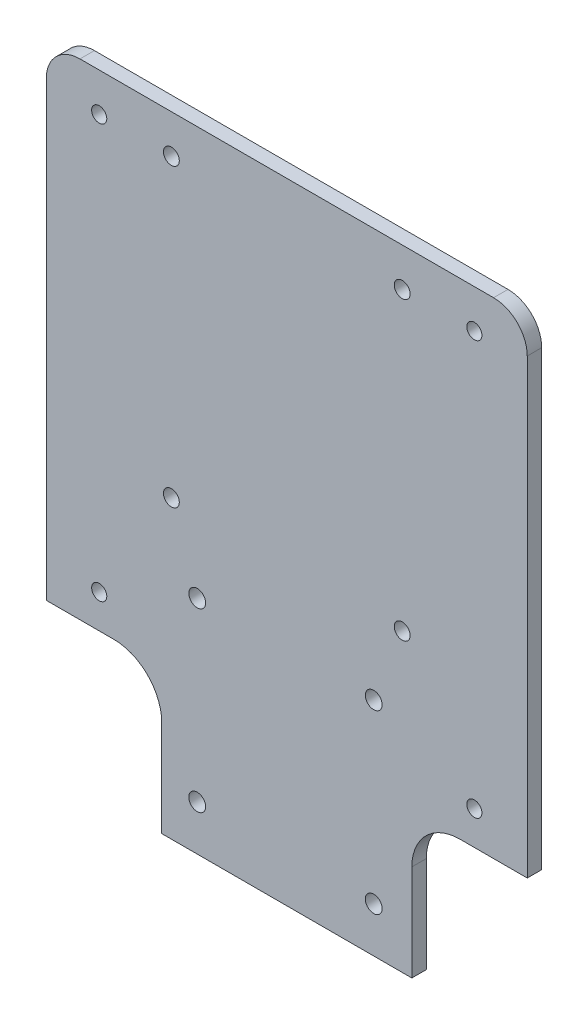
ISO-10303-21;
HEADER;
FILE_DESCRIPTION(('STEP AP214'),'2;1');
FILE_NAME('part.step','',(''),(''),'','','');
FILE_SCHEMA(('AUTOMOTIVE_DESIGN { 1 0 10303 214 1 1 1 1 }'));
ENDSEC;
DATA;
#1=APPLICATION_CONTEXT('core data for automotive mechanical design processes');
#2=APPLICATION_PROTOCOL_DEFINITION('international standard','automotive_design',2000,#1);
#3=PRODUCT_CONTEXT('',#1,'mechanical');
#4=PRODUCT('Part','Part','',(#3));
#5=PRODUCT_RELATED_PRODUCT_CATEGORY('part','',(#4));
#6=PRODUCT_DEFINITION_FORMATION('','',#4);
#7=PRODUCT_DEFINITION_CONTEXT('part definition',#1,'design');
#8=PRODUCT_DEFINITION('design','',#6,#7);
#9=PRODUCT_DEFINITION_SHAPE('','',#8);
#10=(LENGTH_UNIT() NAMED_UNIT(*) SI_UNIT(.MILLI.,.METRE.));
#11=(NAMED_UNIT(*) PLANE_ANGLE_UNIT() SI_UNIT($,.RADIAN.));
#12=(NAMED_UNIT(*) SI_UNIT($,.STERADIAN.) SOLID_ANGLE_UNIT());
#13=UNCERTAINTY_MEASURE_WITH_UNIT(LENGTH_MEASURE(1.E-05),#10,'distance_accuracy_value','');
#14=(GEOMETRIC_REPRESENTATION_CONTEXT(3) GLOBAL_UNCERTAINTY_ASSIGNED_CONTEXT((#13)) GLOBAL_UNIT_ASSIGNED_CONTEXT((#10,
#11,#12)) REPRESENTATION_CONTEXT('',''));
#15=CARTESIAN_POINT('',(0.,0.,0.));
#16=DIRECTION('',(0.,0.,1.));
#17=DIRECTION('',(1.,0.,0.));
#18=AXIS2_PLACEMENT_3D('',#15,#16,#17);
#19=CARTESIAN_POINT('',(43.,149.,30.));
#20=DIRECTION('',(0.,0.,1.));
#21=DIRECTION('',(1.,0.,0.));
#22=AXIS2_PLACEMENT_3D('',#19,#20,#21);
#23=PLANE('',#22);
#24=CARTESIAN_POINT('',(24.,147.97865418197,30.));
#25=DIRECTION('',(0.,0.,1.));
#26=DIRECTION('',(-1.,0.,0.));
#27=AXIS2_PLACEMENT_3D('',#24,#25,#26);
#28=CIRCLE('',#27,1.65000000000001);
#29=CARTESIAN_POINT('',(22.35,147.97865418197,30.));
#30=VERTEX_POINT('',#29);
#31=EDGE_CURVE('E513',#30,#30,#28,.T.);
#32=ORIENTED_EDGE('',*,*,#31,.F.);
#33=EDGE_LOOP('',(#32));
#34=FACE_BOUND('',#33,.T.);
#35=CARTESIAN_POINT('',(-24.,86.4786541819704,30.));
#36=DIRECTION('',(0.,0.,1.));
#37=DIRECTION('',(-1.,0.,0.));
#38=AXIS2_PLACEMENT_3D('',#35,#36,#37);
#39=CIRCLE('',#38,1.65);
#40=CARTESIAN_POINT('',(-25.65,86.4786541819704,30.));
#41=VERTEX_POINT('',#40);
#42=EDGE_CURVE('E524',#41,#41,#39,.T.);
#43=ORIENTED_EDGE('',*,*,#42,.F.);
#44=EDGE_LOOP('',(#43));
#45=FACE_BOUND('',#44,.T.);
#46=CARTESIAN_POINT('',(24.,86.4786541819704,30.));
#47=DIRECTION('',(0.,0.,1.));
#48=DIRECTION('',(1.,0.,0.));
#49=AXIS2_PLACEMENT_3D('',#46,#47,#48);
#50=CIRCLE('',#49,1.65);
#51=CARTESIAN_POINT('',(25.65,86.4786541819704,30.));
#52=VERTEX_POINT('',#51);
#53=EDGE_CURVE('E527',#52,#52,#50,.T.);
#54=ORIENTED_EDGE('',*,*,#53,.F.);
#55=EDGE_LOOP('',(#54));
#56=FACE_BOUND('',#55,.T.);
#57=CARTESIAN_POINT('',(-24.,147.97865418197,30.));
#58=DIRECTION('',(0.,0.,1.));
#59=DIRECTION('',(1.,0.,0.));
#60=AXIS2_PLACEMENT_3D('',#57,#58,#59);
#61=CIRCLE('',#60,1.65000000000001);
#62=CARTESIAN_POINT('',(-22.35,147.97865418197,30.));
#63=VERTEX_POINT('',#62);
#64=EDGE_CURVE('E210',#63,#63,#61,.T.);
#65=ORIENTED_EDGE('',*,*,#64,.F.);
#66=EDGE_LOOP('',(#65));
#67=FACE_BOUND('',#66,.T.);
#68=CARTESIAN_POINT('',(-39.,148.,30.));
#69=DIRECTION('',(0.,0.,1.));
#70=DIRECTION('',(1.,0.,0.));
#71=AXIS2_PLACEMENT_3D('',#68,#69,#70);
#72=CIRCLE('',#71,1.575);
#73=CARTESIAN_POINT('',(-37.425,148.,30.));
#74=VERTEX_POINT('',#73);
#75=EDGE_CURVE('E539',#74,#74,#72,.T.);
#76=ORIENTED_EDGE('',*,*,#75,.F.);
#77=EDGE_LOOP('',(#76));
#78=FACE_BOUND('',#77,.T.);
#79=CARTESIAN_POINT('',(-39.,61.9999999999998,30.));
#80=DIRECTION('',(0.,0.,1.));
#81=DIRECTION('',(1.,0.,0.));
#82=AXIS2_PLACEMENT_3D('',#79,#80,#81);
#83=CIRCLE('',#82,1.575);
#84=CARTESIAN_POINT('',(-37.425,61.9999999999998,30.));
#85=VERTEX_POINT('',#84);
#86=EDGE_CURVE('E551',#85,#85,#83,.T.);
#87=ORIENTED_EDGE('',*,*,#86,.F.);
#88=EDGE_LOOP('',(#87));
#89=FACE_BOUND('',#88,.T.);
#90=CARTESIAN_POINT('',(-18.6214451930755,34.3947889007737,30.));
#91=DIRECTION('',(0.,0.,1.));
#92=DIRECTION('',(1.,0.,0.));
#93=AXIS2_PLACEMENT_3D('',#90,#91,#92);
#94=CIRCLE('',#93,1.75);
#95=CARTESIAN_POINT('',(-16.8714451930755,34.3947889007737,30.));
#96=VERTEX_POINT('',#95);
#97=EDGE_CURVE('E563',#96,#96,#94,.T.);
#98=ORIENTED_EDGE('',*,*,#97,.F.);
#99=EDGE_LOOP('',(#98));
#100=FACE_BOUND('',#99,.T.);
#101=CARTESIAN_POINT('',(-18.6214451930756,71.0947889007737,30.));
#102=DIRECTION('',(0.,0.,1.));
#103=DIRECTION('',(1.,0.,0.));
#104=AXIS2_PLACEMENT_3D('',#101,#102,#103);
#105=CIRCLE('',#104,1.75);
#106=CARTESIAN_POINT('',(-16.8714451930756,71.0947889007737,30.));
#107=VERTEX_POINT('',#106);
#108=EDGE_CURVE('E170',#107,#107,#105,.T.);
#109=ORIENTED_EDGE('',*,*,#108,.F.);
#110=EDGE_LOOP('',(#109));
#111=FACE_BOUND('',#110,.T.);
#112=DIRECTION('',(0.,1.,0.));
#113=VECTOR('',#112,1.);
#114=CARTESIAN_POINT('',(50.,54.9999999999999,30.));
#115=LINE('',#114,#113);
#116=CARTESIAN_POINT('',(50.,54.9999999999999,30.));
#117=VERTEX_POINT('',#116);
#118=CARTESIAN_POINT('',(50.,149.,30.));
#119=VERTEX_POINT('',#118);
#120=EDGE_CURVE('E122',#117,#119,#115,.T.);
#121=ORIENTED_EDGE('',*,*,#120,.T.);
#122=CARTESIAN_POINT('',(43.,149.,30.));
#123=DIRECTION('',(0.,0.,1.));
#124=DIRECTION('',(1.,0.,0.));
#125=AXIS2_PLACEMENT_3D('',#122,#123,#124);
#126=CIRCLE('',#125,7.);
#127=CARTESIAN_POINT('',(43.,156.,30.));
#128=VERTEX_POINT('',#127);
#129=EDGE_CURVE('E126',#119,#128,#126,.T.);
#130=ORIENTED_EDGE('',*,*,#129,.T.);
#131=DIRECTION('',(-1.,0.,0.));
#132=VECTOR('',#131,1.);
#133=CARTESIAN_POINT('',(-43.,156.,30.));
#134=LINE('',#133,#132);
#135=CARTESIAN_POINT('',(-43.,156.,30.));
#136=VERTEX_POINT('',#135);
#137=EDGE_CURVE('E148',#128,#136,#134,.T.);
#138=ORIENTED_EDGE('',*,*,#137,.T.);
#139=CARTESIAN_POINT('',(-43.,149.,30.));
#140=DIRECTION('',(0.,0.,1.));
#141=DIRECTION('',(1.,0.,0.));
#142=AXIS2_PLACEMENT_3D('',#139,#140,#141);
#143=CIRCLE('',#142,7.);
#144=CARTESIAN_POINT('',(-50.,149.,30.));
#145=VERTEX_POINT('',#144);
#146=EDGE_CURVE('E150',#136,#145,#143,.T.);
#147=ORIENTED_EDGE('',*,*,#146,.T.);
#148=DIRECTION('',(0.,-1.,0.));
#149=VECTOR('',#148,1.);
#150=CARTESIAN_POINT('',(-50.,113.94391481191,30.));
#151=LINE('',#150,#149);
#152=CARTESIAN_POINT('',(-50.,54.9999999999999,30.));
#153=VERTEX_POINT('',#152);
#154=EDGE_CURVE('E155',#145,#153,#151,.T.);
#155=ORIENTED_EDGE('',*,*,#154,.T.);
#156=DIRECTION('',(1.,0.,0.));
#157=VECTOR('',#156,1.);
#158=CARTESIAN_POINT('',(-50.,54.9999999999999,30.));
#159=LINE('',#158,#157);
#160=CARTESIAN_POINT('',(-36.,54.9999999999999,30.));
#161=VERTEX_POINT('',#160);
#162=EDGE_CURVE('E157',#153,#161,#159,.T.);
#163=ORIENTED_EDGE('',*,*,#162,.T.);
#164=CARTESIAN_POINT('',(-36.,44.9999999999998,30.));
#165=DIRECTION('',(0.,0.,1.));
#166=DIRECTION('',(1.,0.,0.));
#167=AXIS2_PLACEMENT_3D('',#164,#165,#166);
#168=CIRCLE('',#167,10.);
#169=CARTESIAN_POINT('',(-26.,44.9999999999998,30.));
#170=VERTEX_POINT('',#169);
#171=EDGE_CURVE('E11',#161,#170,#168,.F.);
#172=ORIENTED_EDGE('',*,*,#171,.T.);
#173=DIRECTION('',(0.,-1.,0.));
#174=VECTOR('',#173,1.);
#175=CARTESIAN_POINT('',(-26.,54.9999999999999,30.));
#176=LINE('',#175,#174);
#177=CARTESIAN_POINT('',(-26.,24.9999999999999,30.));
#178=VERTEX_POINT('',#177);
#179=EDGE_CURVE('E159',#170,#178,#176,.T.);
#180=ORIENTED_EDGE('',*,*,#179,.T.);
#181=DIRECTION('',(1.,0.,0.));
#182=VECTOR('',#181,1.);
#183=CARTESIAN_POINT('',(-26.,24.9999999999999,30.));
#184=LINE('',#183,#182);
#185=CARTESIAN_POINT('',(26.,24.9999999999999,30.));
#186=VERTEX_POINT('',#185);
#187=EDGE_CURVE('E161',#178,#186,#184,.T.);
#188=ORIENTED_EDGE('',*,*,#187,.T.);
#189=DIRECTION('',(0.,1.,0.));
#190=VECTOR('',#189,1.);
#191=CARTESIAN_POINT('',(26.,24.9999999999999,30.));
#192=LINE('',#191,#190);
#193=CARTESIAN_POINT('',(26.,44.9999999999998,30.));
#194=VERTEX_POINT('',#193);
#195=EDGE_CURVE('E163',#186,#194,#192,.T.);
#196=ORIENTED_EDGE('',*,*,#195,.T.);
#197=CARTESIAN_POINT('',(36.,44.9999999999998,30.));
#198=DIRECTION('',(0.,0.,1.));
#199=DIRECTION('',(1.,0.,0.));
#200=AXIS2_PLACEMENT_3D('',#197,#198,#199);
#201=CIRCLE('',#200,10.);
#202=CARTESIAN_POINT('',(36.,54.9999999999999,30.));
#203=VERTEX_POINT('',#202);
#204=EDGE_CURVE('E230',#194,#203,#201,.F.);
#205=ORIENTED_EDGE('',*,*,#204,.T.);
#206=DIRECTION('',(1.,0.,0.));
#207=VECTOR('',#206,1.);
#208=CARTESIAN_POINT('',(26.,54.9999999999999,30.));
#209=LINE('',#208,#207);
#210=EDGE_CURVE('E129',#203,#117,#209,.T.);
#211=ORIENTED_EDGE('',*,*,#210,.T.);
#212=EDGE_LOOP('',(#121,#130,#138,#147,#155,#163,#172,#180,#188,#196,#205,#211));
#213=FACE_BOUND('',#212,.T.);
#214=CARTESIAN_POINT('',(18.0785548069244,71.0947889007737,30.));
#215=DIRECTION('',(0.,0.,1.));
#216=DIRECTION('',(1.,0.,0.));
#217=AXIS2_PLACEMENT_3D('',#214,#215,#216);
#218=CIRCLE('',#217,1.75);
#219=CARTESIAN_POINT('',(19.8285548069244,71.0947889007737,30.));
#220=VERTEX_POINT('',#219);
#221=EDGE_CURVE('E569',#220,#220,#218,.T.);
#222=ORIENTED_EDGE('',*,*,#221,.F.);
#223=EDGE_LOOP('',(#222));
#224=FACE_BOUND('',#223,.T.);
#225=CARTESIAN_POINT('',(39.,61.9999999999999,30.));
#226=DIRECTION('',(0.,0.,1.));
#227=DIRECTION('',(1.,0.,0.));
#228=AXIS2_PLACEMENT_3D('',#225,#226,#227);
#229=CIRCLE('',#228,1.575);
#230=CARTESIAN_POINT('',(40.575,61.9999999999999,30.));
#231=VERTEX_POINT('',#230);
#232=EDGE_CURVE('E557',#231,#231,#229,.T.);
#233=ORIENTED_EDGE('',*,*,#232,.F.);
#234=EDGE_LOOP('',(#233));
#235=FACE_BOUND('',#234,.T.);
#236=CARTESIAN_POINT('',(39.,148.,30.));
#237=DIRECTION('',(0.,0.,1.));
#238=DIRECTION('',(1.,0.,0.));
#239=AXIS2_PLACEMENT_3D('',#236,#237,#238);
#240=CIRCLE('',#239,1.575);
#241=CARTESIAN_POINT('',(40.575,148.,30.));
#242=VERTEX_POINT('',#241);
#243=EDGE_CURVE('E545',#242,#242,#240,.T.);
#244=ORIENTED_EDGE('',*,*,#243,.F.);
#245=EDGE_LOOP('',(#244));
#246=FACE_BOUND('',#245,.T.);
#247=CARTESIAN_POINT('',(18.0785548069245,34.3947889007737,30.));
#248=DIRECTION('',(0.,0.,1.));
#249=DIRECTION('',(1.,0.,0.));
#250=AXIS2_PLACEMENT_3D('',#247,#248,#249);
#251=CIRCLE('',#250,1.75);
#252=CARTESIAN_POINT('',(19.8285548069245,34.3947889007737,30.));
#253=VERTEX_POINT('',#252);
#254=EDGE_CURVE('E533',#253,#253,#251,.T.);
#255=ORIENTED_EDGE('',*,*,#254,.F.);
#256=EDGE_LOOP('',(#255));
#257=FACE_BOUND('',#256,.T.);
#258=ADVANCED_FACE('F34',(#34,#45,#56,#67,#78,#89,#100,#111,#213,#224,#235,#246,#257),#23,.T.);
#259=CARTESIAN_POINT('',(43.,149.,27.));
#260=DIRECTION('',(0.,0.,1.));
#261=DIRECTION('',(1.,0.,0.));
#262=AXIS2_PLACEMENT_3D('',#259,#260,#261);
#263=PLANE('',#262);
#264=CARTESIAN_POINT('',(24.,147.97865418197,27.));
#265=DIRECTION('',(0.,0.,1.));
#266=DIRECTION('',(1.,0.,0.));
#267=AXIS2_PLACEMENT_3D('',#264,#265,#266);
#268=CIRCLE('',#267,1.65000000000001);
#269=CARTESIAN_POINT('',(25.65,147.97865418197,27.));
#270=VERTEX_POINT('',#269);
#271=EDGE_CURVE('E216',#270,#270,#268,.T.);
#272=ORIENTED_EDGE('',*,*,#271,.T.);
#273=EDGE_LOOP('',(#272));
#274=FACE_BOUND('',#273,.T.);
#275=CARTESIAN_POINT('',(-24.,86.4786541819704,27.));
#276=DIRECTION('',(0.,0.,1.));
#277=DIRECTION('',(1.,0.,0.));
#278=AXIS2_PLACEMENT_3D('',#275,#276,#277);
#279=CIRCLE('',#278,1.65);
#280=CARTESIAN_POINT('',(-22.35,86.4786541819704,27.));
#281=VERTEX_POINT('',#280);
#282=EDGE_CURVE('E213',#281,#281,#279,.T.);
#283=ORIENTED_EDGE('',*,*,#282,.T.);
#284=EDGE_LOOP('',(#283));
#285=FACE_BOUND('',#284,.T.);
#286=CARTESIAN_POINT('',(24.,86.4786541819704,27.));
#287=DIRECTION('',(0.,0.,1.));
#288=DIRECTION('',(1.,0.,0.));
#289=AXIS2_PLACEMENT_3D('',#286,#287,#288);
#290=CIRCLE('',#289,1.65);
#291=CARTESIAN_POINT('',(25.65,86.4786541819704,27.));
#292=VERTEX_POINT('',#291);
#293=EDGE_CURVE('E209',#292,#292,#290,.T.);
#294=ORIENTED_EDGE('',*,*,#293,.T.);
#295=EDGE_LOOP('',(#294));
#296=FACE_BOUND('',#295,.T.);
#297=CARTESIAN_POINT('',(-24.,147.97865418197,27.));
#298=DIRECTION('',(0.,0.,1.));
#299=DIRECTION('',(1.,0.,0.));
#300=AXIS2_PLACEMENT_3D('',#297,#298,#299);
#301=CIRCLE('',#300,1.65000000000001);
#302=CARTESIAN_POINT('',(-22.35,147.97865418197,27.));
#303=VERTEX_POINT('',#302);
#304=EDGE_CURVE('E206',#303,#303,#301,.T.);
#305=ORIENTED_EDGE('',*,*,#304,.T.);
#306=EDGE_LOOP('',(#305));
#307=FACE_BOUND('',#306,.T.);
#308=DIRECTION('',(0.,1.,0.));
#309=VECTOR('',#308,1.);
#310=CARTESIAN_POINT('',(50.,113.94391481191,27.));
#311=LINE('',#310,#309);
#312=CARTESIAN_POINT('',(50.,54.9999999999999,27.));
#313=VERTEX_POINT('',#312);
#314=CARTESIAN_POINT('',(50.,149.,27.));
#315=VERTEX_POINT('',#314);
#316=EDGE_CURVE('E139',#313,#315,#311,.T.);
#317=ORIENTED_EDGE('',*,*,#316,.F.);
#318=DIRECTION('',(1.,0.,0.));
#319=VECTOR('',#318,1.);
#320=CARTESIAN_POINT('',(26.,54.9999999999999,27.));
#321=LINE('',#320,#319);
#322=CARTESIAN_POINT('',(36.,54.9999999999999,27.));
#323=VERTEX_POINT('',#322);
#324=EDGE_CURVE('E133',#323,#313,#321,.T.);
#325=ORIENTED_EDGE('',*,*,#324,.F.);
#326=CARTESIAN_POINT('',(36.,44.9999999999998,27.));
#327=DIRECTION('',(0.,0.,1.));
#328=DIRECTION('',(1.,0.,0.));
#329=AXIS2_PLACEMENT_3D('',#326,#327,#328);
#330=CIRCLE('',#329,10.);
#331=CARTESIAN_POINT('',(26.,44.9999999999998,27.));
#332=VERTEX_POINT('',#331);
#333=EDGE_CURVE('E228',#323,#332,#330,.T.);
#334=ORIENTED_EDGE('',*,*,#333,.T.);
#335=DIRECTION('',(0.,1.,0.));
#336=VECTOR('',#335,1.);
#337=CARTESIAN_POINT('',(26.,24.9999999999999,27.));
#338=LINE('',#337,#336);
#339=CARTESIAN_POINT('',(26.,24.9999999999999,27.));
#340=VERTEX_POINT('',#339);
#341=EDGE_CURVE('E185',#340,#332,#338,.T.);
#342=ORIENTED_EDGE('',*,*,#341,.F.);
#343=DIRECTION('',(1.,0.,0.));
#344=VECTOR('',#343,1.);
#345=CARTESIAN_POINT('',(-26.,24.9999999999999,27.));
#346=LINE('',#345,#344);
#347=CARTESIAN_POINT('',(-26.,24.9999999999999,27.));
#348=VERTEX_POINT('',#347);
#349=EDGE_CURVE('E183',#348,#340,#346,.T.);
#350=ORIENTED_EDGE('',*,*,#349,.F.);
#351=DIRECTION('',(0.,-1.,0.));
#352=VECTOR('',#351,1.);
#353=CARTESIAN_POINT('',(-26.,54.9999999999999,27.));
#354=LINE('',#353,#352);
#355=CARTESIAN_POINT('',(-26.,44.9999999999998,27.));
#356=VERTEX_POINT('',#355);
#357=EDGE_CURVE('E181',#356,#348,#354,.T.);
#358=ORIENTED_EDGE('',*,*,#357,.F.);
#359=CARTESIAN_POINT('',(-36.,44.9999999999998,27.));
#360=DIRECTION('',(0.,0.,1.));
#361=DIRECTION('',(1.,0.,0.));
#362=AXIS2_PLACEMENT_3D('',#359,#360,#361);
#363=CIRCLE('',#362,10.);
#364=CARTESIAN_POINT('',(-36.,54.9999999999999,27.));
#365=VERTEX_POINT('',#364);
#366=EDGE_CURVE('E42',#356,#365,#363,.T.);
#367=ORIENTED_EDGE('',*,*,#366,.T.);
#368=DIRECTION('',(1.,0.,0.));
#369=VECTOR('',#368,1.);
#370=CARTESIAN_POINT('',(-50.,54.9999999999999,27.));
#371=LINE('',#370,#369);
#372=CARTESIAN_POINT('',(-50.,54.9999999999999,27.));
#373=VERTEX_POINT('',#372);
#374=EDGE_CURVE('E179',#373,#365,#371,.T.);
#375=ORIENTED_EDGE('',*,*,#374,.F.);
#376=DIRECTION('',(0.,-1.,0.));
#377=VECTOR('',#376,1.);
#378=CARTESIAN_POINT('',(-50.,113.94391481191,27.));
#379=LINE('',#378,#377);
#380=CARTESIAN_POINT('',(-50.,149.,27.));
#381=VERTEX_POINT('',#380);
#382=EDGE_CURVE('E177',#381,#373,#379,.T.);
#383=ORIENTED_EDGE('',*,*,#382,.F.);
#384=CARTESIAN_POINT('',(-43.,149.,27.));
#385=DIRECTION('',(0.,0.,1.));
#386=DIRECTION('',(1.,0.,0.));
#387=AXIS2_PLACEMENT_3D('',#384,#385,#386);
#388=CIRCLE('',#387,7.);
#389=CARTESIAN_POINT('',(-43.,156.,27.));
#390=VERTEX_POINT('',#389);
#391=EDGE_CURVE('E174',#390,#381,#388,.T.);
#392=ORIENTED_EDGE('',*,*,#391,.F.);
#393=DIRECTION('',(-1.,0.,0.));
#394=VECTOR('',#393,1.);
#395=CARTESIAN_POINT('',(-43.,156.,27.));
#396=LINE('',#395,#394);
#397=CARTESIAN_POINT('',(43.,156.,27.));
#398=VERTEX_POINT('',#397);
#399=EDGE_CURVE('E172',#398,#390,#396,.T.);
#400=ORIENTED_EDGE('',*,*,#399,.F.);
#401=CARTESIAN_POINT('',(43.,149.,27.));
#402=DIRECTION('',(0.,0.,1.));
#403=DIRECTION('',(1.,0.,0.));
#404=AXIS2_PLACEMENT_3D('',#401,#402,#403);
#405=CIRCLE('',#404,7.);
#406=EDGE_CURVE('E169',#315,#398,#405,.T.);
#407=ORIENTED_EDGE('',*,*,#406,.F.);
#408=EDGE_LOOP('',(#317,#325,#334,#342,#350,#358,#367,#375,#383,#392,#400,#407));
#409=FACE_BOUND('',#408,.T.);
#410=CARTESIAN_POINT('',(-18.6214451930756,71.0947889007737,27.));
#411=DIRECTION('',(0.,0.,1.));
#412=DIRECTION('',(1.,0.,0.));
#413=AXIS2_PLACEMENT_3D('',#410,#411,#412);
#414=CIRCLE('',#413,1.75);
#415=CARTESIAN_POINT('',(-16.8714451930756,71.0947889007737,27.));
#416=VERTEX_POINT('',#415);
#417=EDGE_CURVE('E572',#416,#416,#414,.T.);
#418=ORIENTED_EDGE('',*,*,#417,.T.);
#419=EDGE_LOOP('',(#418));
#420=FACE_BOUND('',#419,.T.);
#421=CARTESIAN_POINT('',(18.0785548069244,71.0947889007737,27.));
#422=DIRECTION('',(0.,0.,1.));
#423=DIRECTION('',(1.,0.,0.));
#424=AXIS2_PLACEMENT_3D('',#421,#422,#423);
#425=CIRCLE('',#424,1.75);
#426=CARTESIAN_POINT('',(19.8285548069244,71.0947889007737,27.));
#427=VERTEX_POINT('',#426);
#428=EDGE_CURVE('E566',#427,#427,#425,.T.);
#429=ORIENTED_EDGE('',*,*,#428,.T.);
#430=EDGE_LOOP('',(#429));
#431=FACE_BOUND('',#430,.T.);
#432=CARTESIAN_POINT('',(-18.6214451930755,34.3947889007737,27.));
#433=DIRECTION('',(0.,0.,1.));
#434=DIRECTION('',(1.,0.,0.));
#435=AXIS2_PLACEMENT_3D('',#432,#433,#434);
#436=CIRCLE('',#435,1.75);
#437=CARTESIAN_POINT('',(-16.8714451930755,34.3947889007737,27.));
#438=VERTEX_POINT('',#437);
#439=EDGE_CURVE('E560',#438,#438,#436,.T.);
#440=ORIENTED_EDGE('',*,*,#439,.T.);
#441=EDGE_LOOP('',(#440));
#442=FACE_BOUND('',#441,.T.);
#443=CARTESIAN_POINT('',(39.,61.9999999999999,27.));
#444=DIRECTION('',(0.,0.,1.));
#445=DIRECTION('',(1.,0.,0.));
#446=AXIS2_PLACEMENT_3D('',#443,#444,#445);
#447=CIRCLE('',#446,1.575);
#448=CARTESIAN_POINT('',(40.575,61.9999999999999,27.));
#449=VERTEX_POINT('',#448);
#450=EDGE_CURVE('E554',#449,#449,#447,.T.);
#451=ORIENTED_EDGE('',*,*,#450,.T.);
#452=EDGE_LOOP('',(#451));
#453=FACE_BOUND('',#452,.T.);
#454=CARTESIAN_POINT('',(-39.,61.9999999999998,27.));
#455=DIRECTION('',(0.,0.,1.));
#456=DIRECTION('',(1.,0.,0.));
#457=AXIS2_PLACEMENT_3D('',#454,#455,#456);
#458=CIRCLE('',#457,1.575);
#459=CARTESIAN_POINT('',(-37.425,61.9999999999998,27.));
#460=VERTEX_POINT('',#459);
#461=EDGE_CURVE('E548',#460,#460,#458,.T.);
#462=ORIENTED_EDGE('',*,*,#461,.T.);
#463=EDGE_LOOP('',(#462));
#464=FACE_BOUND('',#463,.T.);
#465=CARTESIAN_POINT('',(39.,148.,27.));
#466=DIRECTION('',(0.,0.,1.));
#467=DIRECTION('',(1.,0.,0.));
#468=AXIS2_PLACEMENT_3D('',#465,#466,#467);
#469=CIRCLE('',#468,1.575);
#470=CARTESIAN_POINT('',(40.575,148.,27.));
#471=VERTEX_POINT('',#470);
#472=EDGE_CURVE('E542',#471,#471,#469,.T.);
#473=ORIENTED_EDGE('',*,*,#472,.T.);
#474=EDGE_LOOP('',(#473));
#475=FACE_BOUND('',#474,.T.);
#476=CARTESIAN_POINT('',(-39.,148.,27.));
#477=DIRECTION('',(0.,0.,1.));
#478=DIRECTION('',(1.,0.,0.));
#479=AXIS2_PLACEMENT_3D('',#476,#477,#478);
#480=CIRCLE('',#479,1.575);
#481=CARTESIAN_POINT('',(-37.425,148.,27.));
#482=VERTEX_POINT('',#481);
#483=EDGE_CURVE('E536',#482,#482,#480,.T.);
#484=ORIENTED_EDGE('',*,*,#483,.T.);
#485=EDGE_LOOP('',(#484));
#486=FACE_BOUND('',#485,.T.);
#487=CARTESIAN_POINT('',(18.0785548069245,34.3947889007737,27.));
#488=DIRECTION('',(0.,0.,1.));
#489=DIRECTION('',(1.,0.,0.));
#490=AXIS2_PLACEMENT_3D('',#487,#488,#489);
#491=CIRCLE('',#490,1.75);
#492=CARTESIAN_POINT('',(19.8285548069245,34.3947889007737,27.));
#493=VERTEX_POINT('',#492);
#494=EDGE_CURVE('E219',#493,#493,#491,.T.);
#495=ORIENTED_EDGE('',*,*,#494,.T.);
#496=EDGE_LOOP('',(#495));
#497=FACE_BOUND('',#496,.T.);
#498=ADVANCED_FACE('F241',(#274,#285,#296,#307,#409,#420,#431,#442,#453,#464,#475,#486,#497),
#263,.F.);
#499=CARTESIAN_POINT('',(50.,113.94391481191,30.));
#500=DIRECTION('',(-1.,0.,0.));
#501=DIRECTION('',(0.,0.,1.));
#502=AXIS2_PLACEMENT_3D('',#499,#500,#501);
#503=PLANE('',#502);
#504=ORIENTED_EDGE('',*,*,#316,.T.);
#505=DIRECTION('',(0.,0.,-1.));
#506=VECTOR('',#505,1.);
#507=CARTESIAN_POINT('',(50.,149.,30.));
#508=LINE('',#507,#506);
#509=EDGE_CURVE('E136',#119,#315,#508,.T.);
#510=ORIENTED_EDGE('',*,*,#509,.F.);
#511=ORIENTED_EDGE('',*,*,#120,.F.);
#512=DIRECTION('',(0.,0.,-1.));
#513=VECTOR('',#512,1.);
#514=CARTESIAN_POINT('',(50.,54.9999999999999,30.));
#515=LINE('',#514,#513);
#516=EDGE_CURVE('E167',#117,#313,#515,.T.);
#517=ORIENTED_EDGE('',*,*,#516,.T.);
#518=EDGE_LOOP('',(#504,#510,#511,#517));
#519=FACE_BOUND('',#518,.T.);
#520=ADVANCED_FACE('F137',(#519),#503,.F.);
#521=CARTESIAN_POINT('',(43.,149.,30.));
#522=DIRECTION('',(0.,0.,-1.));
#523=DIRECTION('',(-1.,0.,0.));
#524=AXIS2_PLACEMENT_3D('',#521,#522,#523);
#525=CYLINDRICAL_SURFACE('',#524,7.);
#526=ORIENTED_EDGE('',*,*,#406,.T.);
#527=DIRECTION('',(0.,0.,-1.));
#528=VECTOR('',#527,1.);
#529=CARTESIAN_POINT('',(43.,156.,30.));
#530=LINE('',#529,#528);
#531=EDGE_CURVE('E143',#128,#398,#530,.T.);
#532=ORIENTED_EDGE('',*,*,#531,.F.);
#533=ORIENTED_EDGE('',*,*,#129,.F.);
#534=ORIENTED_EDGE('',*,*,#509,.T.);
#535=EDGE_LOOP('',(#526,#532,#533,#534));
#536=FACE_BOUND('',#535,.T.);
#537=ADVANCED_FACE('F145',(#536),#525,.T.);
#538=CARTESIAN_POINT('',(-43.,156.,30.));
#539=DIRECTION('',(0.,-1.,0.));
#540=DIRECTION('',(0.,0.,-1.));
#541=AXIS2_PLACEMENT_3D('',#538,#539,#540);
#542=PLANE('',#541);
#543=ORIENTED_EDGE('',*,*,#399,.T.);
#544=DIRECTION('',(0.,0.,-1.));
#545=VECTOR('',#544,1.);
#546=CARTESIAN_POINT('',(-43.,156.,30.));
#547=LINE('',#546,#545);
#548=EDGE_CURVE('E202',#136,#390,#547,.T.);
#549=ORIENTED_EDGE('',*,*,#548,.F.);
#550=ORIENTED_EDGE('',*,*,#137,.F.);
#551=ORIENTED_EDGE('',*,*,#531,.T.);
#552=EDGE_LOOP('',(#543,#549,#550,#551));
#553=FACE_BOUND('',#552,.T.);
#554=ADVANCED_FACE('F276',(#553),#542,.F.);
#555=CARTESIAN_POINT('',(-43.,149.,30.));
#556=DIRECTION('',(0.,0.,-1.));
#557=DIRECTION('',(-1.,0.,0.));
#558=AXIS2_PLACEMENT_3D('',#555,#556,#557);
#559=CYLINDRICAL_SURFACE('',#558,7.);
#560=ORIENTED_EDGE('',*,*,#391,.T.);
#561=DIRECTION('',(0.,0.,-1.));
#562=VECTOR('',#561,1.);
#563=CARTESIAN_POINT('',(-50.,149.,30.));
#564=LINE('',#563,#562);
#565=EDGE_CURVE('E199',#145,#381,#564,.T.);
#566=ORIENTED_EDGE('',*,*,#565,.F.);
#567=ORIENTED_EDGE('',*,*,#146,.F.);
#568=ORIENTED_EDGE('',*,*,#548,.T.);
#569=EDGE_LOOP('',(#560,#566,#567,#568));
#570=FACE_BOUND('',#569,.T.);
#571=ADVANCED_FACE('F265',(#570),#559,.T.);
#572=CARTESIAN_POINT('',(-50.,113.94391481191,30.));
#573=DIRECTION('',(1.,0.,0.));
#574=DIRECTION('',(0.,1.,0.));
#575=AXIS2_PLACEMENT_3D('',#572,#573,#574);
#576=PLANE('',#575);
#577=ORIENTED_EDGE('',*,*,#382,.T.);
#578=DIRECTION('',(0.,0.,-1.));
#579=VECTOR('',#578,1.);
#580=CARTESIAN_POINT('',(-50.,54.9999999999999,30.));
#581=LINE('',#580,#579);
#582=EDGE_CURVE('E196',#153,#373,#581,.T.);
#583=ORIENTED_EDGE('',*,*,#582,.F.);
#584=ORIENTED_EDGE('',*,*,#154,.F.);
#585=ORIENTED_EDGE('',*,*,#565,.T.);
#586=EDGE_LOOP('',(#577,#583,#584,#585));
#587=FACE_BOUND('',#586,.T.);
#588=ADVANCED_FACE('F268',(#587),#576,.F.);
#589=CARTESIAN_POINT('',(-50.,54.9999999999999,30.));
#590=DIRECTION('',(0.,1.,0.));
#591=DIRECTION('',(0.,0.,1.));
#592=AXIS2_PLACEMENT_3D('',#589,#590,#591);
#593=PLANE('',#592);
#594=ORIENTED_EDGE('',*,*,#374,.T.);
#595=DIRECTION('',(0.,0.,-1.));
#596=VECTOR('',#595,1.);
#597=CARTESIAN_POINT('',(-36.,54.9999999999999,30.));
#598=LINE('',#597,#596);
#599=EDGE_CURVE('E49',#365,#161,#598,.F.);
#600=ORIENTED_EDGE('',*,*,#599,.T.);
#601=ORIENTED_EDGE('',*,*,#162,.F.);
#602=ORIENTED_EDGE('',*,*,#582,.T.);
#603=EDGE_LOOP('',(#594,#600,#601,#602));
#604=FACE_BOUND('',#603,.T.);
#605=ADVANCED_FACE('F259',(#604),#593,.F.);
#606=CARTESIAN_POINT('',(-26.,54.9999999999999,30.));
#607=DIRECTION('',(1.,0.,0.));
#608=DIRECTION('',(0.,1.,0.));
#609=AXIS2_PLACEMENT_3D('',#606,#607,#608);
#610=PLANE('',#609);
#611=ORIENTED_EDGE('',*,*,#179,.F.);
#612=DIRECTION('',(0.,0.,-1.));
#613=VECTOR('',#612,1.);
#614=CARTESIAN_POINT('',(-26.,44.9999999999998,27.));
#615=LINE('',#614,#613);
#616=EDGE_CURVE('E224',#170,#356,#615,.T.);
#617=ORIENTED_EDGE('',*,*,#616,.T.);
#618=ORIENTED_EDGE('',*,*,#357,.T.);
#619=DIRECTION('',(0.,0.,-1.));
#620=VECTOR('',#619,1.);
#621=CARTESIAN_POINT('',(-26.,24.9999999999999,30.));
#622=LINE('',#621,#620);
#623=EDGE_CURVE('E193',#178,#348,#622,.T.);
#624=ORIENTED_EDGE('',*,*,#623,.F.);
#625=EDGE_LOOP('',(#611,#617,#618,#624));
#626=FACE_BOUND('',#625,.T.);
#627=ADVANCED_FACE('F253',(#626),#610,.F.);
#628=CARTESIAN_POINT('',(-26.,24.9999999999999,30.));
#629=DIRECTION('',(0.,1.,0.));
#630=DIRECTION('',(0.,0.,1.));
#631=AXIS2_PLACEMENT_3D('',#628,#629,#630);
#632=PLANE('',#631);
#633=ORIENTED_EDGE('',*,*,#349,.T.);
#634=DIRECTION('',(0.,0.,-1.));
#635=VECTOR('',#634,1.);
#636=CARTESIAN_POINT('',(26.,24.9999999999999,30.));
#637=LINE('',#636,#635);
#638=EDGE_CURVE('E190',#186,#340,#637,.T.);
#639=ORIENTED_EDGE('',*,*,#638,.F.);
#640=ORIENTED_EDGE('',*,*,#187,.F.);
#641=ORIENTED_EDGE('',*,*,#623,.T.);
#642=EDGE_LOOP('',(#633,#639,#640,#641));
#643=FACE_BOUND('',#642,.T.);
#644=ADVANCED_FACE('F249',(#643),#632,.F.);
#645=CARTESIAN_POINT('',(26.,24.9999999999999,30.));
#646=DIRECTION('',(-1.,0.,0.));
#647=DIRECTION('',(0.,0.,1.));
#648=AXIS2_PLACEMENT_3D('',#645,#646,#647);
#649=PLANE('',#648);
#650=ORIENTED_EDGE('',*,*,#341,.T.);
#651=DIRECTION('',(0.,0.,-1.));
#652=VECTOR('',#651,1.);
#653=CARTESIAN_POINT('',(26.,44.9999999999998,30.));
#654=LINE('',#653,#652);
#655=EDGE_CURVE('E222',#332,#194,#654,.F.);
#656=ORIENTED_EDGE('',*,*,#655,.T.);
#657=ORIENTED_EDGE('',*,*,#195,.F.);
#658=ORIENTED_EDGE('',*,*,#638,.T.);
#659=EDGE_LOOP('',(#650,#656,#657,#658));
#660=FACE_BOUND('',#659,.T.);
#661=ADVANCED_FACE('F245',(#660),#649,.F.);
#662=CARTESIAN_POINT('',(26.,54.9999999999999,30.));
#663=DIRECTION('',(0.,1.,0.));
#664=DIRECTION('',(-1.,0.,0.));
#665=AXIS2_PLACEMENT_3D('',#662,#663,#664);
#666=PLANE('',#665);
#667=ORIENTED_EDGE('',*,*,#210,.F.);
#668=DIRECTION('',(0.,0.,-1.));
#669=VECTOR('',#668,1.);
#670=CARTESIAN_POINT('',(36.,54.9999999999999,27.));
#671=LINE('',#670,#669);
#672=EDGE_CURVE('E142',#203,#323,#671,.T.);
#673=ORIENTED_EDGE('',*,*,#672,.T.);
#674=ORIENTED_EDGE('',*,*,#324,.T.);
#675=ORIENTED_EDGE('',*,*,#516,.F.);
#676=EDGE_LOOP('',(#667,#673,#674,#675));
#677=FACE_BOUND('',#676,.T.);
#678=ADVANCED_FACE('F237',(#677),#666,.F.);
#679=CARTESIAN_POINT('',(-18.6214451930756,71.0947889007737,30.));
#680=DIRECTION('',(0.,0.,-1.));
#681=DIRECTION('',(-1.,0.,0.));
#682=AXIS2_PLACEMENT_3D('',#679,#680,#681);
#683=CYLINDRICAL_SURFACE('',#682,1.75);
#684=ORIENTED_EDGE('',*,*,#108,.T.);
#685=EDGE_LOOP('',(#684));
#686=FACE_BOUND('',#685,.T.);
#687=ORIENTED_EDGE('',*,*,#417,.F.);
#688=EDGE_LOOP('',(#687));
#689=FACE_BOUND('',#688,.T.);
#690=ADVANCED_FACE('F289',(#686,#689),#683,.F.);
#691=CARTESIAN_POINT('',(18.0785548069244,71.0947889007737,30.));
#692=DIRECTION('',(0.,0.,-1.));
#693=DIRECTION('',(-1.,0.,0.));
#694=AXIS2_PLACEMENT_3D('',#691,#692,#693);
#695=CYLINDRICAL_SURFACE('',#694,1.75);
#696=ORIENTED_EDGE('',*,*,#221,.T.);
#697=EDGE_LOOP('',(#696));
#698=FACE_BOUND('',#697,.T.);
#699=ORIENTED_EDGE('',*,*,#428,.F.);
#700=EDGE_LOOP('',(#699));
#701=FACE_BOUND('',#700,.T.);
#702=ADVANCED_FACE('F322',(#698,#701),#695,.F.);
#703=CARTESIAN_POINT('',(-18.6214451930755,34.3947889007737,30.));
#704=DIRECTION('',(0.,0.,-1.));
#705=DIRECTION('',(-1.,0.,0.));
#706=AXIS2_PLACEMENT_3D('',#703,#704,#705);
#707=CYLINDRICAL_SURFACE('',#706,1.75);
#708=ORIENTED_EDGE('',*,*,#97,.T.);
#709=EDGE_LOOP('',(#708));
#710=FACE_BOUND('',#709,.T.);
#711=ORIENTED_EDGE('',*,*,#439,.F.);
#712=EDGE_LOOP('',(#711));
#713=FACE_BOUND('',#712,.T.);
#714=ADVANCED_FACE('F329',(#710,#713),#707,.F.);
#715=CARTESIAN_POINT('',(39.,61.9999999999999,30.));
#716=DIRECTION('',(0.,0.,-1.));
#717=DIRECTION('',(-1.,0.,0.));
#718=AXIS2_PLACEMENT_3D('',#715,#716,#717);
#719=CYLINDRICAL_SURFACE('',#718,1.575);
#720=ORIENTED_EDGE('',*,*,#232,.T.);
#721=EDGE_LOOP('',(#720));
#722=FACE_BOUND('',#721,.T.);
#723=ORIENTED_EDGE('',*,*,#450,.F.);
#724=EDGE_LOOP('',(#723));
#725=FACE_BOUND('',#724,.T.);
#726=ADVANCED_FACE('F336',(#722,#725),#719,.F.);
#727=CARTESIAN_POINT('',(-39.,61.9999999999998,30.));
#728=DIRECTION('',(0.,0.,-1.));
#729=DIRECTION('',(-1.,0.,0.));
#730=AXIS2_PLACEMENT_3D('',#727,#728,#729);
#731=CYLINDRICAL_SURFACE('',#730,1.575);
#732=ORIENTED_EDGE('',*,*,#86,.T.);
#733=EDGE_LOOP('',(#732));
#734=FACE_BOUND('',#733,.T.);
#735=ORIENTED_EDGE('',*,*,#461,.F.);
#736=EDGE_LOOP('',(#735));
#737=FACE_BOUND('',#736,.T.);
#738=ADVANCED_FACE('F344',(#734,#737),#731,.F.);
#739=CARTESIAN_POINT('',(39.,148.,30.));
#740=DIRECTION('',(0.,0.,-1.));
#741=DIRECTION('',(-1.,0.,0.));
#742=AXIS2_PLACEMENT_3D('',#739,#740,#741);
#743=CYLINDRICAL_SURFACE('',#742,1.575);
#744=ORIENTED_EDGE('',*,*,#243,.T.);
#745=EDGE_LOOP('',(#744));
#746=FACE_BOUND('',#745,.T.);
#747=ORIENTED_EDGE('',*,*,#472,.F.);
#748=EDGE_LOOP('',(#747));
#749=FACE_BOUND('',#748,.T.);
#750=ADVANCED_FACE('F352',(#746,#749),#743,.F.);
#751=CARTESIAN_POINT('',(-39.,148.,30.));
#752=DIRECTION('',(0.,0.,-1.));
#753=DIRECTION('',(-1.,0.,0.));
#754=AXIS2_PLACEMENT_3D('',#751,#752,#753);
#755=CYLINDRICAL_SURFACE('',#754,1.575);
#756=ORIENTED_EDGE('',*,*,#75,.T.);
#757=EDGE_LOOP('',(#756));
#758=FACE_BOUND('',#757,.T.);
#759=ORIENTED_EDGE('',*,*,#483,.F.);
#760=EDGE_LOOP('',(#759));
#761=FACE_BOUND('',#760,.T.);
#762=ADVANCED_FACE('F360',(#758,#761),#755,.F.);
#763=CARTESIAN_POINT('',(18.0785548069245,34.3947889007737,30.));
#764=DIRECTION('',(0.,0.,-1.));
#765=DIRECTION('',(-1.,0.,0.));
#766=AXIS2_PLACEMENT_3D('',#763,#764,#765);
#767=CYLINDRICAL_SURFACE('',#766,1.75);
#768=ORIENTED_EDGE('',*,*,#254,.T.);
#769=EDGE_LOOP('',(#768));
#770=FACE_BOUND('',#769,.T.);
#771=ORIENTED_EDGE('',*,*,#494,.F.);
#772=EDGE_LOOP('',(#771));
#773=FACE_BOUND('',#772,.T.);
#774=ADVANCED_FACE('F368',(#770,#773),#767,.F.);
#775=CARTESIAN_POINT('',(-24.,147.97865418197,20.));
#776=DIRECTION('',(0.,0.,1.));
#777=DIRECTION('',(1.,0.,0.));
#778=AXIS2_PLACEMENT_3D('',#775,#776,#777);
#779=CYLINDRICAL_SURFACE('',#778,1.65000000000001);
#780=ORIENTED_EDGE('',*,*,#64,.T.);
#781=EDGE_LOOP('',(#780));
#782=FACE_BOUND('',#781,.T.);
#783=ORIENTED_EDGE('',*,*,#304,.F.);
#784=EDGE_LOOP('',(#783));
#785=FACE_BOUND('',#784,.T.);
#786=ADVANCED_FACE('F376',(#782,#785),#779,.F.);
#787=CARTESIAN_POINT('',(24.,86.4786541819704,20.));
#788=DIRECTION('',(0.,0.,1.));
#789=DIRECTION('',(1.,0.,0.));
#790=AXIS2_PLACEMENT_3D('',#787,#788,#789);
#791=CYLINDRICAL_SURFACE('',#790,1.65);
#792=ORIENTED_EDGE('',*,*,#53,.T.);
#793=EDGE_LOOP('',(#792));
#794=FACE_BOUND('',#793,.T.);
#795=ORIENTED_EDGE('',*,*,#293,.F.);
#796=EDGE_LOOP('',(#795));
#797=FACE_BOUND('',#796,.T.);
#798=ADVANCED_FACE('F384',(#794,#797),#791,.F.);
#799=CARTESIAN_POINT('',(-24.,86.4786541819704,20.));
#800=DIRECTION('',(0.,0.,1.));
#801=DIRECTION('',(1.,0.,0.));
#802=AXIS2_PLACEMENT_3D('',#799,#800,#801);
#803=CYLINDRICAL_SURFACE('',#802,1.65);
#804=ORIENTED_EDGE('',*,*,#42,.T.);
#805=EDGE_LOOP('',(#804));
#806=FACE_BOUND('',#805,.T.);
#807=ORIENTED_EDGE('',*,*,#282,.F.);
#808=EDGE_LOOP('',(#807));
#809=FACE_BOUND('',#808,.T.);
#810=ADVANCED_FACE('F392',(#806,#809),#803,.F.);
#811=CARTESIAN_POINT('',(24.,147.97865418197,20.));
#812=DIRECTION('',(0.,0.,1.));
#813=DIRECTION('',(1.,0.,0.));
#814=AXIS2_PLACEMENT_3D('',#811,#812,#813);
#815=CYLINDRICAL_SURFACE('',#814,1.65000000000001);
#816=ORIENTED_EDGE('',*,*,#31,.T.);
#817=EDGE_LOOP('',(#816));
#818=FACE_BOUND('',#817,.T.);
#819=ORIENTED_EDGE('',*,*,#271,.F.);
#820=EDGE_LOOP('',(#819));
#821=FACE_BOUND('',#820,.T.);
#822=ADVANCED_FACE('F400',(#818,#821),#815,.F.);
#823=CARTESIAN_POINT('',(36.,44.9999999999998,30.));
#824=DIRECTION('',(0.,0.,1.));
#825=DIRECTION('',(1.,0.,0.));
#826=AXIS2_PLACEMENT_3D('',#823,#824,#825);
#827=CYLINDRICAL_SURFACE('',#826,10.);
#828=ORIENTED_EDGE('',*,*,#204,.F.);
#829=ORIENTED_EDGE('',*,*,#655,.F.);
#830=ORIENTED_EDGE('',*,*,#333,.F.);
#831=ORIENTED_EDGE('',*,*,#672,.F.);
#832=EDGE_LOOP('',(#828,#829,#830,#831));
#833=FACE_BOUND('',#832,.T.);
#834=ADVANCED_FACE('F239',(#833),#827,.F.);
#835=CARTESIAN_POINT('',(-36.,44.9999999999998,30.));
#836=DIRECTION('',(0.,0.,1.));
#837=DIRECTION('',(1.,0.,0.));
#838=AXIS2_PLACEMENT_3D('',#835,#836,#837);
#839=CYLINDRICAL_SURFACE('',#838,10.);
#840=ORIENTED_EDGE('',*,*,#171,.F.);
#841=ORIENTED_EDGE('',*,*,#599,.F.);
#842=ORIENTED_EDGE('',*,*,#366,.F.);
#843=ORIENTED_EDGE('',*,*,#616,.F.);
#844=EDGE_LOOP('',(#840,#841,#842,#843));
#845=FACE_BOUND('',#844,.T.);
#846=ADVANCED_FACE('F36',(#845),#839,.F.);
#847=CLOSED_SHELL('',(#258,#498,#520,#537,#554,#571,#588,#605,#627,#644,#661,#678,#690,#702,
#714,#726,#738,#750,#762,#774,#786,#798,#810,#822,#834,#846));
#848=MANIFOLD_SOLID_BREP('B2',#847);
#849=ADVANCED_BREP_SHAPE_REPRESENTATION('',(#18,#848),#14);
#850=SHAPE_DEFINITION_REPRESENTATION(#9,#849);
ENDSEC;
END-ISO-10303-21;
